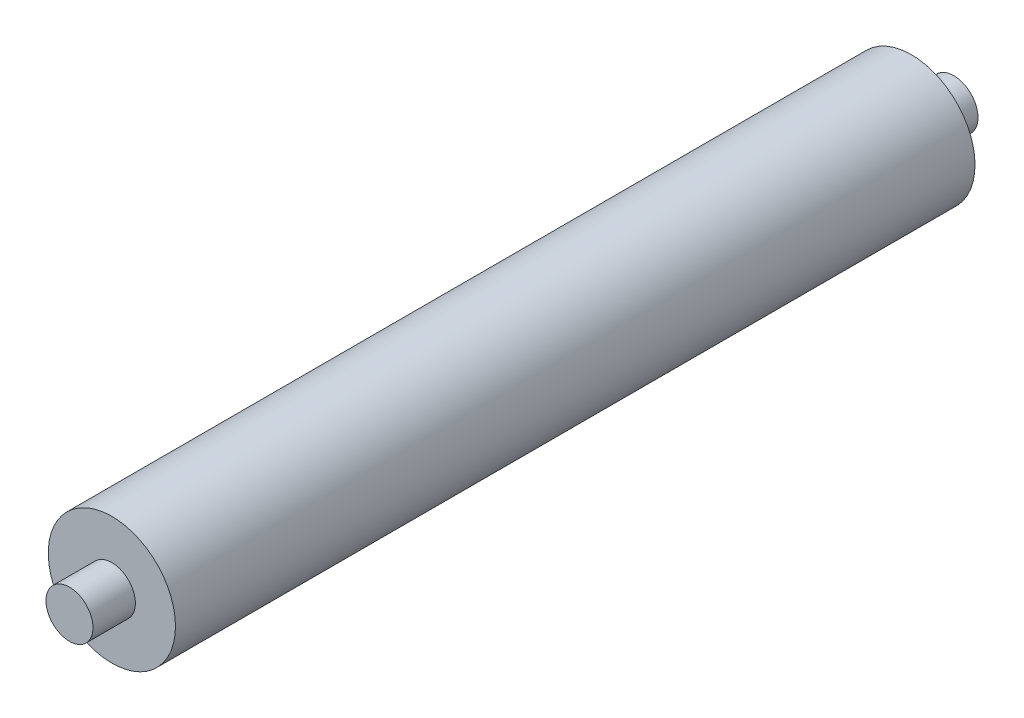
ISO-10303-21;
HEADER;
FILE_DESCRIPTION(('STEP AP214'),'2;1');
FILE_NAME('part.step','',(''),(''),'','','');
FILE_SCHEMA(('AUTOMOTIVE_DESIGN { 1 0 10303 214 1 1 1 1 }'));
ENDSEC;
DATA;
#1=APPLICATION_CONTEXT('core data for automotive mechanical design processes');
#2=APPLICATION_PROTOCOL_DEFINITION('international standard','automotive_design',2000,#1);
#3=PRODUCT_CONTEXT('',#1,'mechanical');
#4=PRODUCT('Part','Part','',(#3));
#5=PRODUCT_RELATED_PRODUCT_CATEGORY('part','',(#4));
#6=PRODUCT_DEFINITION_FORMATION('','',#4);
#7=PRODUCT_DEFINITION_CONTEXT('part definition',#1,'design');
#8=PRODUCT_DEFINITION('design','',#6,#7);
#9=PRODUCT_DEFINITION_SHAPE('','',#8);
#10=(LENGTH_UNIT() NAMED_UNIT(*) SI_UNIT(.MILLI.,.METRE.));
#11=(NAMED_UNIT(*) PLANE_ANGLE_UNIT() SI_UNIT($,.RADIAN.));
#12=(NAMED_UNIT(*) SI_UNIT($,.STERADIAN.) SOLID_ANGLE_UNIT());
#13=UNCERTAINTY_MEASURE_WITH_UNIT(LENGTH_MEASURE(1.E-05),#10,'distance_accuracy_value','');
#14=(GEOMETRIC_REPRESENTATION_CONTEXT(3) GLOBAL_UNCERTAINTY_ASSIGNED_CONTEXT((#13)) GLOBAL_UNIT_ASSIGNED_CONTEXT((#10,
#11,#12)) REPRESENTATION_CONTEXT('',''));
#15=CARTESIAN_POINT('',(0.,0.,0.));
#16=DIRECTION('',(0.,0.,1.));
#17=DIRECTION('',(1.,0.,0.));
#18=AXIS2_PLACEMENT_3D('',#15,#16,#17);
#19=CARTESIAN_POINT('',(0.,0.,132.));
#20=DIRECTION('',(0.,0.,-1.));
#21=DIRECTION('',(-1.,0.,0.));
#22=AXIS2_PLACEMENT_3D('',#19,#20,#21);
#23=CYLINDRICAL_SURFACE('',#22,10.5);
#24=CARTESIAN_POINT('',(0.,0.,132.));
#25=DIRECTION('',(0.,0.,1.));
#26=DIRECTION('',(1.,0.,0.));
#27=AXIS2_PLACEMENT_3D('',#24,#25,#26);
#28=CIRCLE('',#27,10.5);
#29=CARTESIAN_POINT('',(10.5,0.,132.));
#30=VERTEX_POINT('',#29);
#31=EDGE_CURVE('E55',#30,#30,#28,.T.);
#32=ORIENTED_EDGE('',*,*,#31,.F.);
#33=EDGE_LOOP('',(#32));
#34=FACE_BOUND('',#33,.T.);
#35=CARTESIAN_POINT('',(0.,0.,0.));
#36=DIRECTION('',(0.,0.,1.));
#37=DIRECTION('',(1.,0.,0.));
#38=AXIS2_PLACEMENT_3D('',#35,#36,#37);
#39=CIRCLE('',#38,10.5);
#40=CARTESIAN_POINT('',(10.5,0.,0.));
#41=VERTEX_POINT('',#40);
#42=EDGE_CURVE('E44',#41,#41,#39,.T.);
#43=ORIENTED_EDGE('',*,*,#42,.T.);
#44=EDGE_LOOP('',(#43));
#45=FACE_BOUND('',#44,.T.);
#46=ADVANCED_FACE('F41',(#34,#45),#23,.T.);
#47=CARTESIAN_POINT('',(0.,0.,132.));
#48=DIRECTION('',(0.,0.,1.));
#49=DIRECTION('',(1.,0.,0.));
#50=AXIS2_PLACEMENT_3D('',#47,#48,#49);
#51=PLANE('',#50);
#52=CARTESIAN_POINT('',(0.,0.,132.));
#53=DIRECTION('',(0.,0.,1.));
#54=DIRECTION('',(1.,0.,0.));
#55=AXIS2_PLACEMENT_3D('',#52,#53,#54);
#56=CIRCLE('',#55,3.88208696781151);
#57=CARTESIAN_POINT('',(3.88208696781151,0.,132.));
#58=VERTEX_POINT('',#57);
#59=EDGE_CURVE('E49',#58,#58,#56,.T.);
#60=ORIENTED_EDGE('',*,*,#59,.F.);
#61=EDGE_LOOP('',(#60));
#62=FACE_BOUND('',#61,.T.);
#63=ORIENTED_EDGE('',*,*,#31,.T.);
#64=EDGE_LOOP('',(#63));
#65=FACE_BOUND('',#64,.T.);
#66=ADVANCED_FACE('F75',(#62,#65),#51,.T.);
#67=CARTESIAN_POINT('',(0.,0.,0.));
#68=DIRECTION('',(0.,0.,1.));
#69=DIRECTION('',(1.,0.,0.));
#70=AXIS2_PLACEMENT_3D('',#67,#68,#69);
#71=PLANE('',#70);
#72=CARTESIAN_POINT('',(0.,0.,0.));
#73=DIRECTION('',(0.,0.,-1.));
#74=DIRECTION('',(-1.,0.,0.));
#75=AXIS2_PLACEMENT_3D('',#72,#73,#74);
#76=CIRCLE('',#75,4.);
#77=CARTESIAN_POINT('',(-4.,0.,0.));
#78=VERTEX_POINT('',#77);
#79=EDGE_CURVE('E10',#78,#78,#76,.T.);
#80=ORIENTED_EDGE('',*,*,#79,.F.);
#81=EDGE_LOOP('',(#80));
#82=FACE_BOUND('',#81,.T.);
#83=ORIENTED_EDGE('',*,*,#42,.F.);
#84=EDGE_LOOP('',(#83));
#85=FACE_BOUND('',#84,.T.);
#86=ADVANCED_FACE('F72',(#82,#85),#71,.F.);
#87=CARTESIAN_POINT('',(0.,0.,139.));
#88=DIRECTION('',(0.,0.,-1.));
#89=DIRECTION('',(-1.,0.,0.));
#90=AXIS2_PLACEMENT_3D('',#87,#88,#89);
#91=CYLINDRICAL_SURFACE('',#90,3.88208696781151);
#92=CARTESIAN_POINT('',(0.,0.,139.));
#93=DIRECTION('',(0.,0.,1.));
#94=DIRECTION('',(1.,0.,0.));
#95=AXIS2_PLACEMENT_3D('',#92,#93,#94);
#96=CIRCLE('',#95,3.88208696781151);
#97=CARTESIAN_POINT('',(3.88208696781151,0.,139.));
#98=VERTEX_POINT('',#97);
#99=EDGE_CURVE('E60',#98,#98,#96,.T.);
#100=ORIENTED_EDGE('',*,*,#99,.F.);
#101=EDGE_LOOP('',(#100));
#102=FACE_BOUND('',#101,.T.);
#103=ORIENTED_EDGE('',*,*,#59,.T.);
#104=EDGE_LOOP('',(#103));
#105=FACE_BOUND('',#104,.T.);
#106=ADVANCED_FACE('F74',(#102,#105),#91,.T.);
#107=CARTESIAN_POINT('',(0.,0.,139.));
#108=DIRECTION('',(0.,0.,1.));
#109=DIRECTION('',(1.,0.,0.));
#110=AXIS2_PLACEMENT_3D('',#107,#108,#109);
#111=PLANE('',#110);
#112=ORIENTED_EDGE('',*,*,#99,.T.);
#113=EDGE_LOOP('',(#112));
#114=FACE_BOUND('',#113,.T.);
#115=ADVANCED_FACE('F81',(#114),#111,.T.);
#116=CARTESIAN_POINT('',(0.,0.,-7.));
#117=DIRECTION('',(0.,0.,1.));
#118=DIRECTION('',(1.,0.,0.));
#119=AXIS2_PLACEMENT_3D('',#116,#117,#118);
#120=CYLINDRICAL_SURFACE('',#119,4.);
#121=CARTESIAN_POINT('',(0.,0.,-7.));
#122=DIRECTION('',(0.,0.,-1.));
#123=DIRECTION('',(-1.,0.,0.));
#124=AXIS2_PLACEMENT_3D('',#121,#122,#123);
#125=CIRCLE('',#124,4.);
#126=CARTESIAN_POINT('',(-4.,0.,-7.));
#127=VERTEX_POINT('',#126);
#128=EDGE_CURVE('E59',#127,#127,#125,.T.);
#129=ORIENTED_EDGE('',*,*,#128,.F.);
#130=EDGE_LOOP('',(#129));
#131=FACE_BOUND('',#130,.T.);
#132=ORIENTED_EDGE('',*,*,#79,.T.);
#133=EDGE_LOOP('',(#132));
#134=FACE_BOUND('',#133,.T.);
#135=ADVANCED_FACE('F111',(#131,#134),#120,.T.);
#136=CARTESIAN_POINT('',(0.,0.,-7.));
#137=DIRECTION('',(0.,0.,-1.));
#138=DIRECTION('',(-1.,0.,0.));
#139=AXIS2_PLACEMENT_3D('',#136,#137,#138);
#140=PLANE('',#139);
#141=ORIENTED_EDGE('',*,*,#128,.T.);
#142=EDGE_LOOP('',(#141));
#143=FACE_BOUND('',#142,.T.);
#144=ADVANCED_FACE('F127',(#143),#140,.T.);
#145=CLOSED_SHELL('',(#46,#66,#86,#106,#115,#135,#144));
#146=MANIFOLD_SOLID_BREP('B2',#145);
#147=ADVANCED_BREP_SHAPE_REPRESENTATION('',(#18,#146),#14);
#148=SHAPE_DEFINITION_REPRESENTATION(#9,#147);
ENDSEC;
END-ISO-10303-21;
